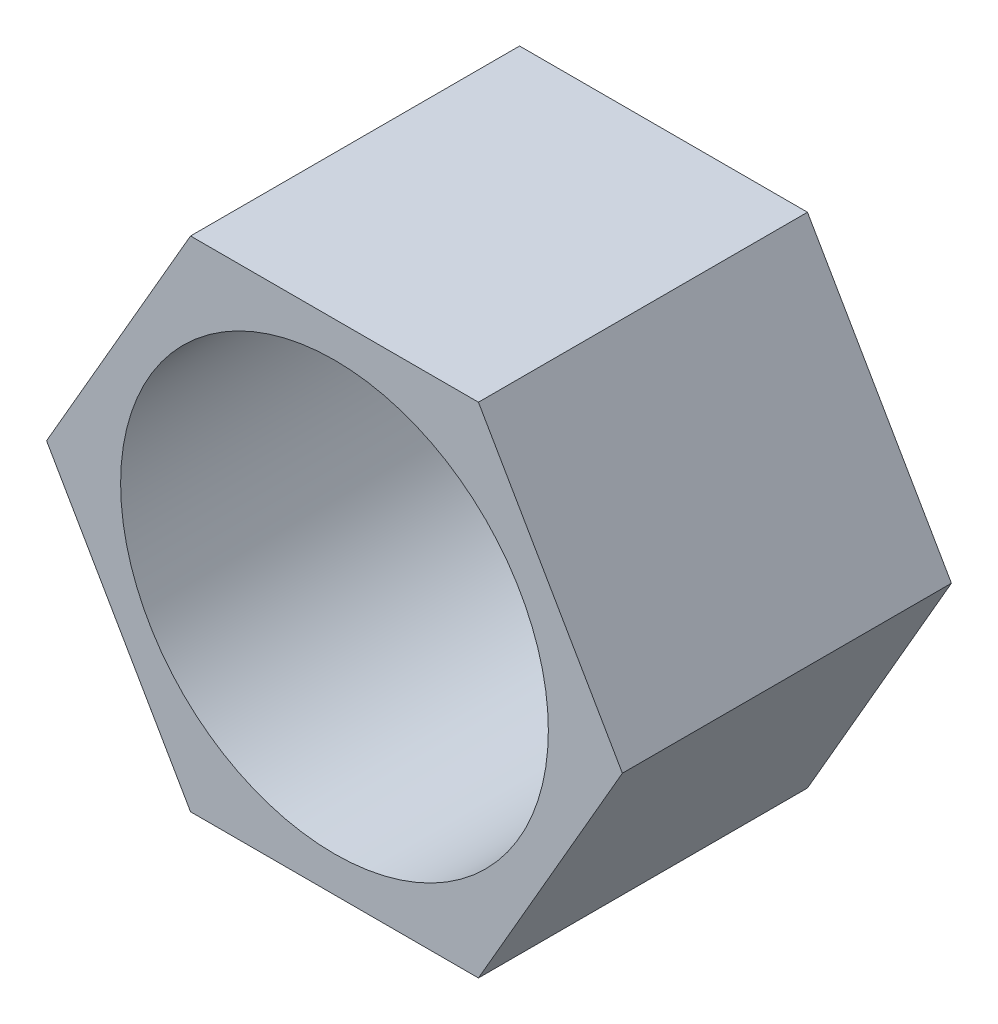
ISO-10303-21;
HEADER;
FILE_DESCRIPTION(('STEP AP214'),'2;1');
FILE_NAME('part.step','',(''),(''),'','','');
FILE_SCHEMA(('AUTOMOTIVE_DESIGN { 1 0 10303 214 1 1 1 1 }'));
ENDSEC;
DATA;
#1=APPLICATION_CONTEXT('core data for automotive mechanical design processes');
#2=APPLICATION_PROTOCOL_DEFINITION('international standard','automotive_design',2000,#1);
#3=PRODUCT_CONTEXT('',#1,'mechanical');
#4=PRODUCT('Part','Part','',(#3));
#5=PRODUCT_RELATED_PRODUCT_CATEGORY('part','',(#4));
#6=PRODUCT_DEFINITION_FORMATION('','',#4);
#7=PRODUCT_DEFINITION_CONTEXT('part definition',#1,'design');
#8=PRODUCT_DEFINITION('design','',#6,#7);
#9=PRODUCT_DEFINITION_SHAPE('','',#8);
#10=(LENGTH_UNIT() NAMED_UNIT(*) SI_UNIT(.MILLI.,.METRE.));
#11=(NAMED_UNIT(*) PLANE_ANGLE_UNIT() SI_UNIT($,.RADIAN.));
#12=(NAMED_UNIT(*) SI_UNIT($,.STERADIAN.) SOLID_ANGLE_UNIT());
#13=UNCERTAINTY_MEASURE_WITH_UNIT(LENGTH_MEASURE(1.E-05),#10,'distance_accuracy_value','');
#14=(GEOMETRIC_REPRESENTATION_CONTEXT(3) GLOBAL_UNCERTAINTY_ASSIGNED_CONTEXT((#13)) GLOBAL_UNIT_ASSIGNED_CONTEXT((#10,
#11,#12)) REPRESENTATION_CONTEXT('',''));
#15=CARTESIAN_POINT('',(0.,0.,0.));
#16=DIRECTION('',(0.,0.,1.));
#17=DIRECTION('',(1.,0.,0.));
#18=AXIS2_PLACEMENT_3D('',#15,#16,#17);
#19=CARTESIAN_POINT('',(0.0875000000000018,-0.151554445662276,0.1));
#20=DIRECTION('',(-0.866025403784442,0.499999999999995,0.));
#21=DIRECTION('',(-0.499999999999995,-0.866025403784442,0.));
#22=AXIS2_PLACEMENT_3D('',#19,#20,#21);
#23=PLANE('',#22);
#24=DIRECTION('',(0.499999999999995,0.866025403784442,0.));
#25=VECTOR('',#24,1.);
#26=CARTESIAN_POINT('',(0.0875000000000018,-0.151554445662276,-0.1));
#27=LINE('',#26,#25);
#28=CARTESIAN_POINT('',(0.0875000000000018,-0.151554445662276,-0.1));
#29=VERTEX_POINT('',#28);
#30=CARTESIAN_POINT('',(0.175,0.,-0.1));
#31=VERTEX_POINT('',#30);
#32=EDGE_CURVE('E116',#29,#31,#27,.T.);
#33=ORIENTED_EDGE('',*,*,#32,.T.);
#34=DIRECTION('',(0.,0.,-1.));
#35=VECTOR('',#34,1.);
#36=CARTESIAN_POINT('',(0.175,0.,0.1));
#37=LINE('',#36,#35);
#38=CARTESIAN_POINT('',(0.175,0.,0.1));
#39=VERTEX_POINT('',#38);
#40=EDGE_CURVE('E11',#39,#31,#37,.T.);
#41=ORIENTED_EDGE('',*,*,#40,.F.);
#42=DIRECTION('',(0.499999999999995,0.866025403784442,0.));
#43=VECTOR('',#42,1.);
#44=CARTESIAN_POINT('',(0.0875000000000018,-0.151554445662276,0.1));
#45=LINE('',#44,#43);
#46=CARTESIAN_POINT('',(0.0875000000000018,-0.151554445662276,0.1));
#47=VERTEX_POINT('',#46);
#48=EDGE_CURVE('E127',#47,#39,#45,.T.);
#49=ORIENTED_EDGE('',*,*,#48,.F.);
#50=DIRECTION('',(0.,0.,-1.));
#51=VECTOR('',#50,1.);
#52=CARTESIAN_POINT('',(0.0875000000000018,-0.151554445662276,0.1));
#53=LINE('',#52,#51);
#54=EDGE_CURVE('E112',#47,#29,#53,.T.);
#55=ORIENTED_EDGE('',*,*,#54,.T.);
#56=EDGE_LOOP('',(#33,#41,#49,#55));
#57=FACE_BOUND('',#56,.T.);
#58=ADVANCED_FACE('F32',(#57),#23,.F.);
#59=CARTESIAN_POINT('',(0.175,0.,0.1));
#60=DIRECTION('',(-0.866025403784438,-0.500000000000001,0.));
#61=DIRECTION('',(0.500000000000001,-0.866025403784438,0.));
#62=AXIS2_PLACEMENT_3D('',#59,#60,#61);
#63=PLANE('',#62);
#64=DIRECTION('',(-0.500000000000001,0.866025403784438,0.));
#65=VECTOR('',#64,1.);
#66=CARTESIAN_POINT('',(0.175,0.,-0.1));
#67=LINE('',#66,#65);
#68=CARTESIAN_POINT('',(0.0874999999999997,0.151554445662277,-0.1));
#69=VERTEX_POINT('',#68);
#70=EDGE_CURVE('E119',#31,#69,#67,.T.);
#71=ORIENTED_EDGE('',*,*,#70,.T.);
#72=DIRECTION('',(0.,0.,-1.));
#73=VECTOR('',#72,1.);
#74=CARTESIAN_POINT('',(0.0874999999999997,0.151554445662277,0.1));
#75=LINE('',#74,#73);
#76=CARTESIAN_POINT('',(0.0874999999999997,0.151554445662277,0.1));
#77=VERTEX_POINT('',#76);
#78=EDGE_CURVE('E40',#77,#69,#75,.T.);
#79=ORIENTED_EDGE('',*,*,#78,.F.);
#80=DIRECTION('',(-0.500000000000001,0.866025403784438,0.));
#81=VECTOR('',#80,1.);
#82=CARTESIAN_POINT('',(0.175,0.,0.1));
#83=LINE('',#82,#81);
#84=EDGE_CURVE('E85',#39,#77,#83,.T.);
#85=ORIENTED_EDGE('',*,*,#84,.F.);
#86=ORIENTED_EDGE('',*,*,#40,.T.);
#87=EDGE_LOOP('',(#71,#79,#85,#86));
#88=FACE_BOUND('',#87,.T.);
#89=ADVANCED_FACE('F152',(#88),#63,.F.);
#90=CARTESIAN_POINT('',(0.0874999999999997,0.151554445662277,0.1));
#91=DIRECTION('',(0.,-1.,0.));
#92=DIRECTION('',(1.,0.,0.));
#93=AXIS2_PLACEMENT_3D('',#90,#91,#92);
#94=PLANE('',#93);
#95=DIRECTION('',(-1.,0.,0.));
#96=VECTOR('',#95,1.);
#97=CARTESIAN_POINT('',(0.0874999999999997,0.151554445662277,-0.1));
#98=LINE('',#97,#96);
#99=CARTESIAN_POINT('',(-0.0875000000000007,0.151554445662276,-0.1));
#100=VERTEX_POINT('',#99);
#101=EDGE_CURVE('E122',#69,#100,#98,.T.);
#102=ORIENTED_EDGE('',*,*,#101,.T.);
#103=DIRECTION('',(0.,0.,-1.));
#104=VECTOR('',#103,1.);
#105=CARTESIAN_POINT('',(-0.0875000000000007,0.151554445662276,0.1));
#106=LINE('',#105,#104);
#107=CARTESIAN_POINT('',(-0.0875000000000007,0.151554445662276,0.1));
#108=VERTEX_POINT('',#107);
#109=EDGE_CURVE('E107',#108,#100,#106,.T.);
#110=ORIENTED_EDGE('',*,*,#109,.F.);
#111=DIRECTION('',(-1.,0.,0.));
#112=VECTOR('',#111,1.);
#113=CARTESIAN_POINT('',(0.0874999999999997,0.151554445662277,0.1));
#114=LINE('',#113,#112);
#115=EDGE_CURVE('E98',#77,#108,#114,.T.);
#116=ORIENTED_EDGE('',*,*,#115,.F.);
#117=ORIENTED_EDGE('',*,*,#78,.T.);
#118=EDGE_LOOP('',(#102,#110,#116,#117));
#119=FACE_BOUND('',#118,.T.);
#120=ADVANCED_FACE('F133',(#119),#94,.F.);
#121=CARTESIAN_POINT('',(-0.0875000000000007,0.151554445662276,0.1));
#122=DIRECTION('',(0.866025403784441,-0.499999999999995,0.));
#123=DIRECTION('',(0.499999999999995,0.866025403784442,0.));
#124=AXIS2_PLACEMENT_3D('',#121,#122,#123);
#125=PLANE('',#124);
#126=DIRECTION('',(-0.499999999999995,-0.866025403784442,0.));
#127=VECTOR('',#126,1.);
#128=CARTESIAN_POINT('',(-0.0875000000000007,0.151554445662276,-0.1));
#129=LINE('',#128,#127);
#130=CARTESIAN_POINT('',(-0.175,0.,-0.1));
#131=VERTEX_POINT('',#130);
#132=EDGE_CURVE('E106',#100,#131,#129,.T.);
#133=ORIENTED_EDGE('',*,*,#132,.T.);
#134=DIRECTION('',(0.,0.,-1.));
#135=VECTOR('',#134,1.);
#136=CARTESIAN_POINT('',(-0.175,0.,0.1));
#137=LINE('',#136,#135);
#138=CARTESIAN_POINT('',(-0.175,0.,0.1));
#139=VERTEX_POINT('',#138);
#140=EDGE_CURVE('E103',#139,#131,#137,.T.);
#141=ORIENTED_EDGE('',*,*,#140,.F.);
#142=DIRECTION('',(-0.499999999999995,-0.866025403784442,0.));
#143=VECTOR('',#142,1.);
#144=CARTESIAN_POINT('',(-0.0875000000000007,0.151554445662276,0.1));
#145=LINE('',#144,#143);
#146=EDGE_CURVE('E92',#108,#139,#145,.T.);
#147=ORIENTED_EDGE('',*,*,#146,.F.);
#148=ORIENTED_EDGE('',*,*,#109,.T.);
#149=EDGE_LOOP('',(#133,#141,#147,#148));
#150=FACE_BOUND('',#149,.T.);
#151=ADVANCED_FACE('F104',(#150),#125,.F.);
#152=CARTESIAN_POINT('',(-0.175,0.,0.1));
#153=DIRECTION('',(0.866025403784435,0.500000000000007,0.));
#154=DIRECTION('',(-0.500000000000007,0.866025403784435,0.));
#155=AXIS2_PLACEMENT_3D('',#152,#153,#154);
#156=PLANE('',#155);
#157=DIRECTION('',(0.500000000000007,-0.866025403784435,0.));
#158=VECTOR('',#157,1.);
#159=CARTESIAN_POINT('',(-0.175,0.,-0.1));
#160=LINE('',#159,#158);
#161=CARTESIAN_POINT('',(-0.0874999999999986,-0.151554445662278,-0.1));
#162=VERTEX_POINT('',#161);
#163=EDGE_CURVE('E71',#131,#162,#160,.T.);
#164=ORIENTED_EDGE('',*,*,#163,.T.);
#165=DIRECTION('',(0.,0.,-1.));
#166=VECTOR('',#165,1.);
#167=CARTESIAN_POINT('',(-0.0874999999999986,-0.151554445662278,0.1));
#168=LINE('',#167,#166);
#169=CARTESIAN_POINT('',(-0.0874999999999986,-0.151554445662278,0.1));
#170=VERTEX_POINT('',#169);
#171=EDGE_CURVE('E108',#170,#162,#168,.T.);
#172=ORIENTED_EDGE('',*,*,#171,.F.);
#173=DIRECTION('',(0.500000000000007,-0.866025403784435,0.));
#174=VECTOR('',#173,1.);
#175=CARTESIAN_POINT('',(-0.175,0.,0.1));
#176=LINE('',#175,#174);
#177=EDGE_CURVE('E96',#139,#170,#176,.T.);
#178=ORIENTED_EDGE('',*,*,#177,.F.);
#179=ORIENTED_EDGE('',*,*,#140,.T.);
#180=EDGE_LOOP('',(#164,#172,#178,#179));
#181=FACE_BOUND('',#180,.T.);
#182=ADVANCED_FACE('F110',(#181),#156,.F.);
#183=CARTESIAN_POINT('',(-0.0874999999999986,-0.151554445662278,0.1));
#184=DIRECTION('',(0.,1.,0.));
#185=DIRECTION('',(-1.,0.,0.));
#186=AXIS2_PLACEMENT_3D('',#183,#184,#185);
#187=PLANE('',#186);
#188=DIRECTION('',(1.,0.,0.));
#189=VECTOR('',#188,1.);
#190=CARTESIAN_POINT('',(-0.0874999999999986,-0.151554445662278,-0.1));
#191=LINE('',#190,#189);
#192=EDGE_CURVE('E77',#162,#29,#191,.T.);
#193=ORIENTED_EDGE('',*,*,#192,.T.);
#194=ORIENTED_EDGE('',*,*,#54,.F.);
#195=DIRECTION('',(1.,0.,0.));
#196=VECTOR('',#195,1.);
#197=CARTESIAN_POINT('',(-0.0874999999999986,-0.151554445662278,0.1));
#198=LINE('',#197,#196);
#199=EDGE_CURVE('E48',#170,#47,#198,.T.);
#200=ORIENTED_EDGE('',*,*,#199,.F.);
#201=ORIENTED_EDGE('',*,*,#171,.T.);
#202=EDGE_LOOP('',(#193,#194,#200,#201));
#203=FACE_BOUND('',#202,.T.);
#204=ADVANCED_FACE('F140',(#203),#187,.F.);
#205=CARTESIAN_POINT('',(0.,0.,0.1));
#206=DIRECTION('',(0.,0.,1.));
#207=DIRECTION('',(1.,0.,0.));
#208=AXIS2_PLACEMENT_3D('',#205,#206,#207);
#209=PLANE('',#208);
#210=CARTESIAN_POINT('',(0.,0.,0.1));
#211=DIRECTION('',(0.,0.,1.));
#212=DIRECTION('',(1.,0.,0.));
#213=AXIS2_PLACEMENT_3D('',#210,#211,#212);
#214=CIRCLE('',#213,0.13);
#215=CARTESIAN_POINT('',(0.13,0.,0.1));
#216=VERTEX_POINT('',#215);
#217=EDGE_CURVE('E207',#216,#216,#214,.T.);
#218=ORIENTED_EDGE('',*,*,#217,.F.);
#219=EDGE_LOOP('',(#218));
#220=FACE_BOUND('',#219,.T.);
#221=ORIENTED_EDGE('',*,*,#48,.T.);
#222=ORIENTED_EDGE('',*,*,#84,.T.);
#223=ORIENTED_EDGE('',*,*,#115,.T.);
#224=ORIENTED_EDGE('',*,*,#146,.T.);
#225=ORIENTED_EDGE('',*,*,#177,.T.);
#226=ORIENTED_EDGE('',*,*,#199,.T.);
#227=EDGE_LOOP('',(#221,#222,#223,#224,#225,#226));
#228=FACE_BOUND('',#227,.T.);
#229=ADVANCED_FACE('F94',(#220,#228),#209,.T.);
#230=CARTESIAN_POINT('',(0.,0.,-0.1));
#231=DIRECTION('',(0.,0.,1.));
#232=DIRECTION('',(1.,0.,0.));
#233=AXIS2_PLACEMENT_3D('',#230,#231,#232);
#234=PLANE('',#233);
#235=CARTESIAN_POINT('',(0.,0.,-0.1));
#236=DIRECTION('',(0.,0.,1.));
#237=DIRECTION('',(1.,0.,0.));
#238=AXIS2_PLACEMENT_3D('',#235,#236,#237);
#239=CIRCLE('',#238,0.13);
#240=CARTESIAN_POINT('',(0.13,0.,-0.1));
#241=VERTEX_POINT('',#240);
#242=EDGE_CURVE('E120',#241,#241,#239,.T.);
#243=ORIENTED_EDGE('',*,*,#242,.T.);
#244=EDGE_LOOP('',(#243));
#245=FACE_BOUND('',#244,.T.);
#246=ORIENTED_EDGE('',*,*,#32,.F.);
#247=ORIENTED_EDGE('',*,*,#192,.F.);
#248=ORIENTED_EDGE('',*,*,#163,.F.);
#249=ORIENTED_EDGE('',*,*,#132,.F.);
#250=ORIENTED_EDGE('',*,*,#101,.F.);
#251=ORIENTED_EDGE('',*,*,#70,.F.);
#252=EDGE_LOOP('',(#246,#247,#248,#249,#250,#251));
#253=FACE_BOUND('',#252,.T.);
#254=ADVANCED_FACE('F136',(#245,#253),#234,.F.);
#255=CARTESIAN_POINT('',(0.,0.,-0.1));
#256=DIRECTION('',(0.,0.,1.));
#257=DIRECTION('',(1.,0.,0.));
#258=AXIS2_PLACEMENT_3D('',#255,#256,#257);
#259=CYLINDRICAL_SURFACE('',#258,0.13);
#260=ORIENTED_EDGE('',*,*,#242,.F.);
#261=EDGE_LOOP('',(#260));
#262=FACE_BOUND('',#261,.T.);
#263=ORIENTED_EDGE('',*,*,#217,.T.);
#264=EDGE_LOOP('',(#263));
#265=FACE_BOUND('',#264,.T.);
#266=ADVANCED_FACE('F189',(#262,#265),#259,.F.);
#267=CLOSED_SHELL('',(#58,#89,#120,#151,#182,#204,#229,#254,#266));
#268=MANIFOLD_SOLID_BREP('B2',#267);
#269=ADVANCED_BREP_SHAPE_REPRESENTATION('',(#18,#268),#14);
#270=SHAPE_DEFINITION_REPRESENTATION(#9,#269);
ENDSEC;
END-ISO-10303-21;
